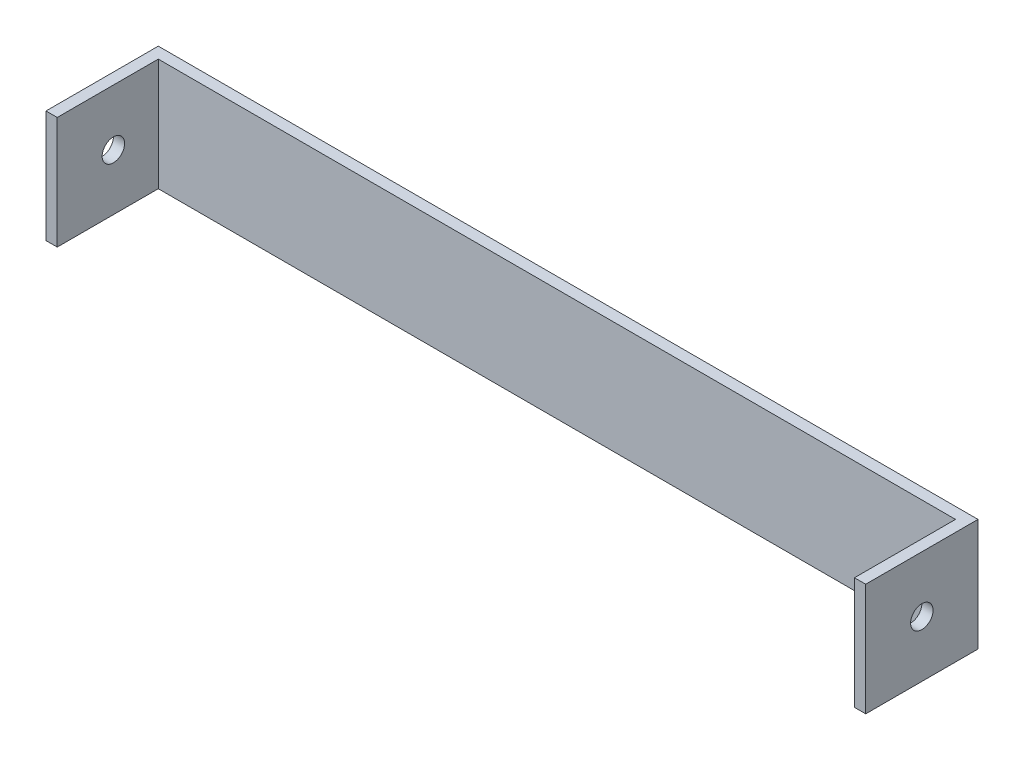
ISO-10303-21;
HEADER;
FILE_DESCRIPTION(('STEP AP214'),'2;1');
FILE_NAME('part.step','',(''),(''),'','','');
FILE_SCHEMA(('AUTOMOTIVE_DESIGN { 1 0 10303 214 1 1 1 1 }'));
ENDSEC;
DATA;
#1=APPLICATION_CONTEXT('core data for automotive mechanical design processes');
#2=APPLICATION_PROTOCOL_DEFINITION('international standard','automotive_design',2000,#1);
#3=PRODUCT_CONTEXT('',#1,'mechanical');
#4=PRODUCT('Part','Part','',(#3));
#5=PRODUCT_RELATED_PRODUCT_CATEGORY('part','',(#4));
#6=PRODUCT_DEFINITION_FORMATION('','',#4);
#7=PRODUCT_DEFINITION_CONTEXT('part definition',#1,'design');
#8=PRODUCT_DEFINITION('design','',#6,#7);
#9=PRODUCT_DEFINITION_SHAPE('','',#8);
#10=(LENGTH_UNIT() NAMED_UNIT(*) SI_UNIT(.MILLI.,.METRE.));
#11=(NAMED_UNIT(*) PLANE_ANGLE_UNIT() SI_UNIT($,.RADIAN.));
#12=(NAMED_UNIT(*) SI_UNIT($,.STERADIAN.) SOLID_ANGLE_UNIT());
#13=UNCERTAINTY_MEASURE_WITH_UNIT(LENGTH_MEASURE(1.E-05),#10,'distance_accuracy_value','');
#14=(GEOMETRIC_REPRESENTATION_CONTEXT(3) GLOBAL_UNCERTAINTY_ASSIGNED_CONTEXT((#13)) GLOBAL_UNIT_ASSIGNED_CONTEXT((#10,
#11,#12)) REPRESENTATION_CONTEXT('',''));
#15=CARTESIAN_POINT('',(0.,0.,0.));
#16=DIRECTION('',(0.,0.,1.));
#17=DIRECTION('',(1.,0.,0.));
#18=AXIS2_PLACEMENT_3D('',#15,#16,#17);
#19=CARTESIAN_POINT('',(0.,0.,2.));
#20=DIRECTION('',(0.,0.,1.));
#21=DIRECTION('',(1.,0.,0.));
#22=AXIS2_PLACEMENT_3D('',#19,#20,#21);
#23=PLANE('',#22);
#24=DIRECTION('',(-1.,0.,0.));
#25=VECTOR('',#24,1.);
#26=CARTESIAN_POINT('',(-73.,10.,2.));
#27=LINE('',#26,#25);
#28=CARTESIAN_POINT('',(71.,10.,2.));
#29=VERTEX_POINT('',#28);
#30=CARTESIAN_POINT('',(-71.,10.,2.));
#31=VERTEX_POINT('',#30);
#32=EDGE_CURVE('E58',#29,#31,#27,.T.);
#33=ORIENTED_EDGE('',*,*,#32,.T.);
#34=DIRECTION('',(0.,1.,0.));
#35=VECTOR('',#34,1.);
#36=CARTESIAN_POINT('',(-71.,10.,2.));
#37=LINE('',#36,#35);
#38=CARTESIAN_POINT('',(-71.,-10.,2.));
#39=VERTEX_POINT('',#38);
#40=EDGE_CURVE('E53',#39,#31,#37,.T.);
#41=ORIENTED_EDGE('',*,*,#40,.F.);
#42=DIRECTION('',(1.,0.,0.));
#43=VECTOR('',#42,1.);
#44=CARTESIAN_POINT('',(-73.,-10.,2.));
#45=LINE('',#44,#43);
#46=CARTESIAN_POINT('',(71.,-10.,2.));
#47=VERTEX_POINT('',#46);
#48=EDGE_CURVE('E159',#39,#47,#45,.T.);
#49=ORIENTED_EDGE('',*,*,#48,.T.);
#50=DIRECTION('',(0.,-1.,0.));
#51=VECTOR('',#50,1.);
#52=CARTESIAN_POINT('',(71.,10.,2.));
#53=LINE('',#52,#51);
#54=EDGE_CURVE('E138',#29,#47,#53,.T.);
#55=ORIENTED_EDGE('',*,*,#54,.F.);
#56=EDGE_LOOP('',(#33,#41,#49,#55));
#57=FACE_BOUND('',#56,.T.);
#58=ADVANCED_FACE('F37',(#57),#23,.T.);
#59=CARTESIAN_POINT('',(73.,10.,2.));
#60=DIRECTION('',(-1.,0.,0.));
#61=DIRECTION('',(0.,0.,1.));
#62=AXIS2_PLACEMENT_3D('',#59,#60,#61);
#63=PLANE('',#62);
#64=CARTESIAN_POINT('',(73.,0.,10.));
#65=DIRECTION('',(-1.,0.,0.));
#66=DIRECTION('',(0.,0.,1.));
#67=AXIS2_PLACEMENT_3D('',#64,#65,#66);
#68=CIRCLE('',#67,2.);
#69=CARTESIAN_POINT('',(73.,0.,12.));
#70=VERTEX_POINT('',#69);
#71=EDGE_CURVE('E309',#70,#70,#68,.T.);
#72=ORIENTED_EDGE('',*,*,#71,.T.);
#73=EDGE_LOOP('',(#72));
#74=FACE_BOUND('',#73,.T.);
#75=DIRECTION('',(0.,1.,0.));
#76=VECTOR('',#75,1.);
#77=CARTESIAN_POINT('',(73.,10.,0.));
#78=LINE('',#77,#76);
#79=CARTESIAN_POINT('',(73.,-10.,0.));
#80=VERTEX_POINT('',#79);
#81=CARTESIAN_POINT('',(73.,10.,0.));
#82=VERTEX_POINT('',#81);
#83=EDGE_CURVE('E157',#80,#82,#78,.T.);
#84=ORIENTED_EDGE('',*,*,#83,.T.);
#85=DIRECTION('',(0.,0.,-1.));
#86=VECTOR('',#85,1.);
#87=CARTESIAN_POINT('',(73.,10.,2.));
#88=LINE('',#87,#86);
#89=CARTESIAN_POINT('',(73.,10.,20.));
#90=VERTEX_POINT('',#89);
#91=EDGE_CURVE('E11',#90,#82,#88,.T.);
#92=ORIENTED_EDGE('',*,*,#91,.F.);
#93=DIRECTION('',(0.,1.,0.));
#94=VECTOR('',#93,1.);
#95=CARTESIAN_POINT('',(73.,10.,20.));
#96=LINE('',#95,#94);
#97=CARTESIAN_POINT('',(73.,-10.,20.));
#98=VERTEX_POINT('',#97);
#99=EDGE_CURVE('E139',#98,#90,#96,.T.);
#100=ORIENTED_EDGE('',*,*,#99,.F.);
#101=DIRECTION('',(0.,0.,-1.));
#102=VECTOR('',#101,1.);
#103=CARTESIAN_POINT('',(73.,-10.,2.));
#104=LINE('',#103,#102);
#105=EDGE_CURVE('E111',#98,#80,#104,.T.);
#106=ORIENTED_EDGE('',*,*,#105,.T.);
#107=EDGE_LOOP('',(#84,#92,#100,#106));
#108=FACE_BOUND('',#107,.T.);
#109=ADVANCED_FACE('F39',(#74,#108),#63,.F.);
#110=CARTESIAN_POINT('',(-73.,10.,2.));
#111=DIRECTION('',(0.,-1.,0.));
#112=DIRECTION('',(0.,0.,-1.));
#113=AXIS2_PLACEMENT_3D('',#110,#111,#112);
#114=PLANE('',#113);
#115=DIRECTION('',(-1.,0.,0.));
#116=VECTOR('',#115,1.);
#117=CARTESIAN_POINT('',(-73.,10.,0.));
#118=LINE('',#117,#116);
#119=CARTESIAN_POINT('',(-73.,10.,0.));
#120=VERTEX_POINT('',#119);
#121=EDGE_CURVE('E164',#82,#120,#118,.T.);
#122=ORIENTED_EDGE('',*,*,#121,.T.);
#123=DIRECTION('',(0.,0.,-1.));
#124=VECTOR('',#123,1.);
#125=CARTESIAN_POINT('',(-73.,10.,2.));
#126=LINE('',#125,#124);
#127=CARTESIAN_POINT('',(-73.,10.,20.));
#128=VERTEX_POINT('',#127);
#129=EDGE_CURVE('E46',#128,#120,#126,.T.);
#130=ORIENTED_EDGE('',*,*,#129,.F.);
#131=DIRECTION('',(-1.,0.,0.));
#132=VECTOR('',#131,1.);
#133=CARTESIAN_POINT('',(-73.,10.,20.));
#134=LINE('',#133,#132);
#135=CARTESIAN_POINT('',(-71.,10.,20.));
#136=VERTEX_POINT('',#135);
#137=EDGE_CURVE('E125',#136,#128,#134,.T.);
#138=ORIENTED_EDGE('',*,*,#137,.F.);
#139=DIRECTION('',(0.,0.,-1.));
#140=VECTOR('',#139,1.);
#141=CARTESIAN_POINT('',(-71.,10.,20.));
#142=LINE('',#141,#140);
#143=EDGE_CURVE('E133',#136,#31,#142,.T.);
#144=ORIENTED_EDGE('',*,*,#143,.T.);
#145=ORIENTED_EDGE('',*,*,#32,.F.);
#146=DIRECTION('',(0.,0.,-1.));
#147=VECTOR('',#146,1.);
#148=CARTESIAN_POINT('',(71.,10.,20.));
#149=LINE('',#148,#147);
#150=CARTESIAN_POINT('',(71.,10.,20.));
#151=VERTEX_POINT('',#150);
#152=EDGE_CURVE('E154',#151,#29,#149,.T.);
#153=ORIENTED_EDGE('',*,*,#152,.F.);
#154=DIRECTION('',(-1.,0.,0.));
#155=VECTOR('',#154,1.);
#156=CARTESIAN_POINT('',(73.,10.,20.));
#157=LINE('',#156,#155);
#158=EDGE_CURVE('E142',#90,#151,#157,.T.);
#159=ORIENTED_EDGE('',*,*,#158,.F.);
#160=ORIENTED_EDGE('',*,*,#91,.T.);
#161=EDGE_LOOP('',(#122,#130,#138,#144,#145,#153,#159,#160));
#162=FACE_BOUND('',#161,.T.);
#163=ADVANCED_FACE('F185',(#162),#114,.F.);
#164=CARTESIAN_POINT('',(-73.,10.,2.));
#165=DIRECTION('',(1.,0.,0.));
#166=DIRECTION('',(0.,0.,-1.));
#167=AXIS2_PLACEMENT_3D('',#164,#165,#166);
#168=PLANE('',#167);
#169=CARTESIAN_POINT('',(-73.,0.,10.));
#170=DIRECTION('',(1.,0.,0.));
#171=DIRECTION('',(0.,0.,-1.));
#172=AXIS2_PLACEMENT_3D('',#169,#170,#171);
#173=CIRCLE('',#172,2.);
#174=CARTESIAN_POINT('',(-73.,0.,8.));
#175=VERTEX_POINT('',#174);
#176=EDGE_CURVE('E127',#175,#175,#173,.T.);
#177=ORIENTED_EDGE('',*,*,#176,.T.);
#178=EDGE_LOOP('',(#177));
#179=FACE_BOUND('',#178,.T.);
#180=DIRECTION('',(0.,-1.,0.));
#181=VECTOR('',#180,1.);
#182=CARTESIAN_POINT('',(-73.,10.,0.));
#183=LINE('',#182,#181);
#184=CARTESIAN_POINT('',(-73.,-10.,0.));
#185=VERTEX_POINT('',#184);
#186=EDGE_CURVE('E108',#120,#185,#183,.T.);
#187=ORIENTED_EDGE('',*,*,#186,.T.);
#188=DIRECTION('',(0.,0.,-1.));
#189=VECTOR('',#188,1.);
#190=CARTESIAN_POINT('',(-73.,-10.,2.));
#191=LINE('',#190,#189);
#192=CARTESIAN_POINT('',(-73.,-10.,20.));
#193=VERTEX_POINT('',#192);
#194=EDGE_CURVE('E101',#193,#185,#191,.T.);
#195=ORIENTED_EDGE('',*,*,#194,.F.);
#196=DIRECTION('',(0.,-1.,0.));
#197=VECTOR('',#196,1.);
#198=CARTESIAN_POINT('',(-73.,10.,20.));
#199=LINE('',#198,#197);
#200=EDGE_CURVE('E106',#128,#193,#199,.T.);
#201=ORIENTED_EDGE('',*,*,#200,.F.);
#202=ORIENTED_EDGE('',*,*,#129,.T.);
#203=EDGE_LOOP('',(#187,#195,#201,#202));
#204=FACE_BOUND('',#203,.T.);
#205=ADVANCED_FACE('F103',(#179,#204),#168,.F.);
#206=CARTESIAN_POINT('',(-73.,-10.,2.));
#207=DIRECTION('',(0.,1.,0.));
#208=DIRECTION('',(0.,0.,1.));
#209=AXIS2_PLACEMENT_3D('',#206,#207,#208);
#210=PLANE('',#209);
#211=DIRECTION('',(1.,0.,0.));
#212=VECTOR('',#211,1.);
#213=CARTESIAN_POINT('',(-73.,-10.,0.));
#214=LINE('',#213,#212);
#215=EDGE_CURVE('E160',#185,#80,#214,.T.);
#216=ORIENTED_EDGE('',*,*,#215,.T.);
#217=ORIENTED_EDGE('',*,*,#105,.F.);
#218=DIRECTION('',(1.,0.,0.));
#219=VECTOR('',#218,1.);
#220=CARTESIAN_POINT('',(73.,-10.,20.));
#221=LINE('',#220,#219);
#222=CARTESIAN_POINT('',(71.,-10.,20.));
#223=VERTEX_POINT('',#222);
#224=EDGE_CURVE('E146',#223,#98,#221,.T.);
#225=ORIENTED_EDGE('',*,*,#224,.F.);
#226=DIRECTION('',(0.,0.,-1.));
#227=VECTOR('',#226,1.);
#228=CARTESIAN_POINT('',(71.,-10.,20.));
#229=LINE('',#228,#227);
#230=EDGE_CURVE('E149',#223,#47,#229,.T.);
#231=ORIENTED_EDGE('',*,*,#230,.T.);
#232=ORIENTED_EDGE('',*,*,#48,.F.);
#233=DIRECTION('',(0.,0.,-1.));
#234=VECTOR('',#233,1.);
#235=CARTESIAN_POINT('',(-71.,-10.,20.));
#236=LINE('',#235,#234);
#237=CARTESIAN_POINT('',(-71.,-10.,20.));
#238=VERTEX_POINT('',#237);
#239=EDGE_CURVE('E117',#238,#39,#236,.T.);
#240=ORIENTED_EDGE('',*,*,#239,.F.);
#241=DIRECTION('',(1.,0.,0.));
#242=VECTOR('',#241,1.);
#243=CARTESIAN_POINT('',(-73.,-10.,20.));
#244=LINE('',#243,#242);
#245=EDGE_CURVE('E114',#193,#238,#244,.T.);
#246=ORIENTED_EDGE('',*,*,#245,.F.);
#247=ORIENTED_EDGE('',*,*,#194,.T.);
#248=EDGE_LOOP('',(#216,#217,#225,#231,#232,#240,#246,#247));
#249=FACE_BOUND('',#248,.T.);
#250=ADVANCED_FACE('F115',(#249),#210,.F.);
#251=CARTESIAN_POINT('',(0.,0.,0.));
#252=DIRECTION('',(0.,0.,1.));
#253=DIRECTION('',(1.,0.,0.));
#254=AXIS2_PLACEMENT_3D('',#251,#252,#253);
#255=PLANE('',#254);
#256=ORIENTED_EDGE('',*,*,#83,.F.);
#257=ORIENTED_EDGE('',*,*,#215,.F.);
#258=ORIENTED_EDGE('',*,*,#186,.F.);
#259=ORIENTED_EDGE('',*,*,#121,.F.);
#260=EDGE_LOOP('',(#256,#257,#258,#259));
#261=FACE_BOUND('',#260,.T.);
#262=ADVANCED_FACE('F173',(#261),#255,.F.);
#263=CARTESIAN_POINT('',(71.,10.,20.));
#264=DIRECTION('',(1.,0.,0.));
#265=DIRECTION('',(0.,0.,-1.));
#266=AXIS2_PLACEMENT_3D('',#263,#264,#265);
#267=PLANE('',#266);
#268=CARTESIAN_POINT('',(71.,0.,10.));
#269=DIRECTION('',(1.,0.,0.));
#270=DIRECTION('',(0.,0.,-1.));
#271=AXIS2_PLACEMENT_3D('',#268,#269,#270);
#272=CIRCLE('',#271,2.);
#273=CARTESIAN_POINT('',(71.,0.,8.));
#274=VERTEX_POINT('',#273);
#275=EDGE_CURVE('E312',#274,#274,#272,.T.);
#276=ORIENTED_EDGE('',*,*,#275,.T.);
#277=EDGE_LOOP('',(#276));
#278=FACE_BOUND('',#277,.T.);
#279=ORIENTED_EDGE('',*,*,#54,.T.);
#280=ORIENTED_EDGE('',*,*,#230,.F.);
#281=DIRECTION('',(0.,-1.,0.));
#282=VECTOR('',#281,1.);
#283=CARTESIAN_POINT('',(71.,10.,20.));
#284=LINE('',#283,#282);
#285=EDGE_CURVE('E144',#151,#223,#284,.T.);
#286=ORIENTED_EDGE('',*,*,#285,.F.);
#287=ORIENTED_EDGE('',*,*,#152,.T.);
#288=EDGE_LOOP('',(#279,#280,#286,#287));
#289=FACE_BOUND('',#288,.T.);
#290=ADVANCED_FACE('F184',(#278,#289),#267,.F.);
#291=CARTESIAN_POINT('',(0.,0.,20.));
#292=DIRECTION('',(0.,0.,-1.));
#293=DIRECTION('',(-1.,0.,0.));
#294=AXIS2_PLACEMENT_3D('',#291,#292,#293);
#295=PLANE('',#294);
#296=ORIENTED_EDGE('',*,*,#99,.T.);
#297=ORIENTED_EDGE('',*,*,#158,.T.);
#298=ORIENTED_EDGE('',*,*,#285,.T.);
#299=ORIENTED_EDGE('',*,*,#224,.T.);
#300=EDGE_LOOP('',(#296,#297,#298,#299));
#301=FACE_BOUND('',#300,.T.);
#302=ADVANCED_FACE('F179',(#301),#295,.F.);
#303=CARTESIAN_POINT('',(-71.,10.,20.));
#304=DIRECTION('',(-1.,0.,0.));
#305=DIRECTION('',(0.,0.,1.));
#306=AXIS2_PLACEMENT_3D('',#303,#304,#305);
#307=PLANE('',#306);
#308=CARTESIAN_POINT('',(-71.,0.,10.));
#309=DIRECTION('',(-1.,0.,0.));
#310=DIRECTION('',(0.,0.,1.));
#311=AXIS2_PLACEMENT_3D('',#308,#309,#310);
#312=CIRCLE('',#311,2.);
#313=CARTESIAN_POINT('',(-71.,0.,12.));
#314=VERTEX_POINT('',#313);
#315=EDGE_CURVE('E41',#314,#314,#312,.T.);
#316=ORIENTED_EDGE('',*,*,#315,.T.);
#317=EDGE_LOOP('',(#316));
#318=FACE_BOUND('',#317,.T.);
#319=ORIENTED_EDGE('',*,*,#40,.T.);
#320=ORIENTED_EDGE('',*,*,#143,.F.);
#321=DIRECTION('',(0.,1.,0.));
#322=VECTOR('',#321,1.);
#323=CARTESIAN_POINT('',(-71.,10.,20.));
#324=LINE('',#323,#322);
#325=EDGE_CURVE('E120',#238,#136,#324,.T.);
#326=ORIENTED_EDGE('',*,*,#325,.F.);
#327=ORIENTED_EDGE('',*,*,#239,.T.);
#328=EDGE_LOOP('',(#319,#320,#326,#327));
#329=FACE_BOUND('',#328,.T.);
#330=ADVANCED_FACE('F188',(#318,#329),#307,.F.);
#331=CARTESIAN_POINT('',(0.,0.,20.));
#332=DIRECTION('',(0.,0.,1.));
#333=DIRECTION('',(1.,0.,0.));
#334=AXIS2_PLACEMENT_3D('',#331,#332,#333);
#335=PLANE('',#334);
#336=ORIENTED_EDGE('',*,*,#200,.T.);
#337=ORIENTED_EDGE('',*,*,#245,.T.);
#338=ORIENTED_EDGE('',*,*,#325,.T.);
#339=ORIENTED_EDGE('',*,*,#137,.T.);
#340=EDGE_LOOP('',(#336,#337,#338,#339));
#341=FACE_BOUND('',#340,.T.);
#342=ADVANCED_FACE('F123',(#341),#335,.T.);
#343=CARTESIAN_POINT('',(73.,0.,10.));
#344=DIRECTION('',(-1.,0.,0.));
#345=DIRECTION('',(0.,0.,1.));
#346=AXIS2_PLACEMENT_3D('',#343,#344,#345);
#347=CYLINDRICAL_SURFACE('',#346,2.);
#348=ORIENTED_EDGE('',*,*,#315,.F.);
#349=EDGE_LOOP('',(#348));
#350=FACE_BOUND('',#349,.T.);
#351=ORIENTED_EDGE('',*,*,#176,.F.);
#352=EDGE_LOOP('',(#351));
#353=FACE_BOUND('',#352,.T.);
#354=ADVANCED_FACE('F196',(#350,#353),#347,.F.);
#355=ORIENTED_EDGE('',*,*,#71,.F.);
#356=EDGE_LOOP('',(#355));
#357=FACE_BOUND('',#356,.T.);
#358=ORIENTED_EDGE('',*,*,#275,.F.);
#359=EDGE_LOOP('',(#358));
#360=FACE_BOUND('',#359,.T.);
#361=ADVANCED_FACE('F293',(#357,#360),#347,.F.);
#362=CLOSED_SHELL('',(#58,#109,#163,#205,#250,#262,#290,#302,#330,#342,#354,#361));
#363=MANIFOLD_SOLID_BREP('B2',#362);
#364=ADVANCED_BREP_SHAPE_REPRESENTATION('',(#18,#363),#14);
#365=SHAPE_DEFINITION_REPRESENTATION(#9,#364);
ENDSEC;
END-ISO-10303-21;
